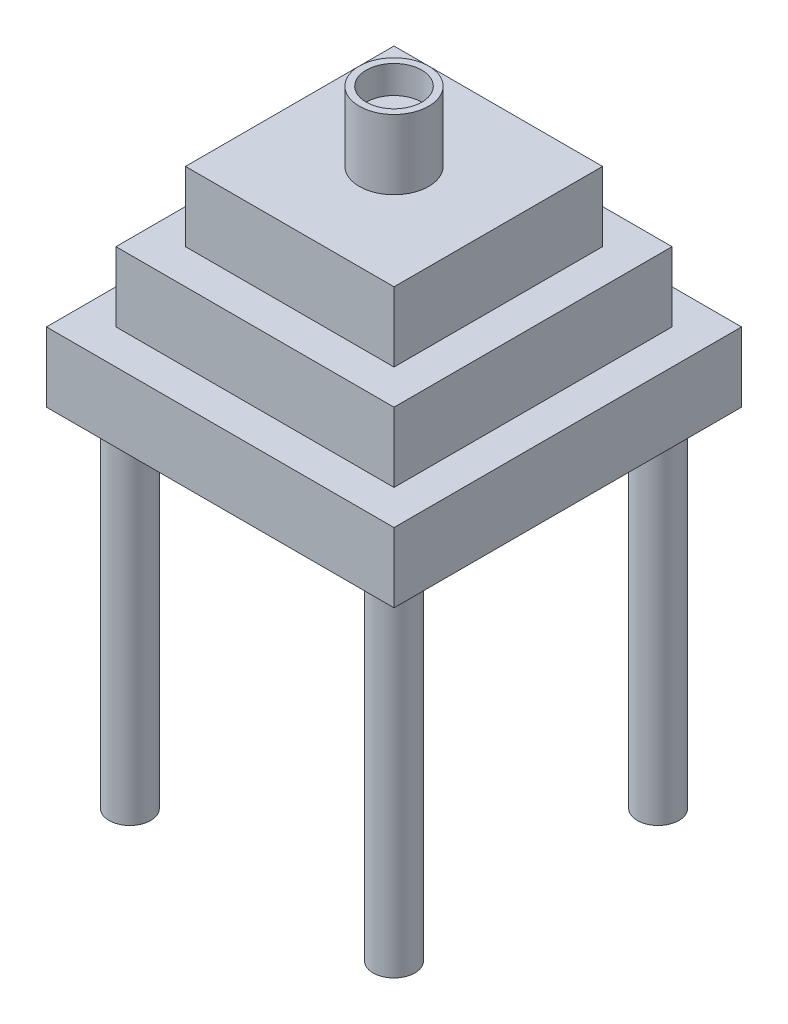
ISO-10303-21;
HEADER;
FILE_DESCRIPTION(('STEP AP214'),'2;1');
FILE_NAME('part.step','',(''),(''),'','','');
FILE_SCHEMA(('AUTOMOTIVE_DESIGN { 1 0 10303 214 1 1 1 1 }'));
ENDSEC;
DATA;
#1=APPLICATION_CONTEXT('core data for automotive mechanical design processes');
#2=APPLICATION_PROTOCOL_DEFINITION('international standard','automotive_design',2000,#1);
#3=PRODUCT_CONTEXT('',#1,'mechanical');
#4=PRODUCT('Part','Part','',(#3));
#5=PRODUCT_RELATED_PRODUCT_CATEGORY('part','',(#4));
#6=PRODUCT_DEFINITION_FORMATION('','',#4);
#7=PRODUCT_DEFINITION_CONTEXT('part definition',#1,'design');
#8=PRODUCT_DEFINITION('design','',#6,#7);
#9=PRODUCT_DEFINITION_SHAPE('','',#8);
#10=(LENGTH_UNIT() NAMED_UNIT(*) SI_UNIT(.MILLI.,.METRE.));
#11=(NAMED_UNIT(*) PLANE_ANGLE_UNIT() SI_UNIT($,.RADIAN.));
#12=(NAMED_UNIT(*) SI_UNIT($,.STERADIAN.) SOLID_ANGLE_UNIT());
#13=UNCERTAINTY_MEASURE_WITH_UNIT(LENGTH_MEASURE(1.E-05),#10,'distance_accuracy_value','');
#14=(GEOMETRIC_REPRESENTATION_CONTEXT(3) GLOBAL_UNCERTAINTY_ASSIGNED_CONTEXT((#13)) GLOBAL_UNIT_ASSIGNED_CONTEXT((#10,
#11,#12)) REPRESENTATION_CONTEXT('',''));
#15=CARTESIAN_POINT('',(0.,0.,0.));
#16=DIRECTION('',(0.,0.,1.));
#17=DIRECTION('',(1.,0.,0.));
#18=AXIS2_PLACEMENT_3D('',#15,#16,#17);
#19=CARTESIAN_POINT('',(0.,700.,0.));
#20=DIRECTION('',(0.,-1.,0.));
#21=DIRECTION('',(0.,0.,-1.));
#22=AXIS2_PLACEMENT_3D('',#19,#20,#21);
#23=PLANE('',#22);
#24=DIRECTION('',(0.,0.,-1.));
#25=VECTOR('',#24,1.);
#26=CARTESIAN_POINT('',(200.,700.,200.));
#27=LINE('',#26,#25);
#28=CARTESIAN_POINT('',(200.,700.,200.));
#29=VERTEX_POINT('',#28);
#30=CARTESIAN_POINT('',(200.,700.,-200.));
#31=VERTEX_POINT('',#30);
#32=EDGE_CURVE('E159',#29,#31,#27,.T.);
#33=ORIENTED_EDGE('',*,*,#32,.T.);
#34=DIRECTION('',(-1.,0.,0.));
#35=VECTOR('',#34,1.);
#36=CARTESIAN_POINT('',(-200.,700.,-200.));
#37=LINE('',#36,#35);
#38=CARTESIAN_POINT('',(-200.,700.,-200.));
#39=VERTEX_POINT('',#38);
#40=EDGE_CURVE('E162',#31,#39,#37,.T.);
#41=ORIENTED_EDGE('',*,*,#40,.T.);
#42=DIRECTION('',(0.,0.,1.));
#43=VECTOR('',#42,1.);
#44=CARTESIAN_POINT('',(-200.,700.,200.));
#45=LINE('',#44,#43);
#46=CARTESIAN_POINT('',(-200.,700.,200.));
#47=VERTEX_POINT('',#46);
#48=EDGE_CURVE('E165',#39,#47,#45,.T.);
#49=ORIENTED_EDGE('',*,*,#48,.T.);
#50=DIRECTION('',(1.,0.,0.));
#51=VECTOR('',#50,1.);
#52=CARTESIAN_POINT('',(-200.,700.,200.));
#53=LINE('',#52,#51);
#54=EDGE_CURVE('E167',#47,#29,#53,.T.);
#55=ORIENTED_EDGE('',*,*,#54,.T.);
#56=EDGE_LOOP('',(#33,#41,#49,#55));
#57=FACE_BOUND('',#56,.T.);
#58=DIRECTION('',(0.,0.,-1.));
#59=VECTOR('',#58,1.);
#60=CARTESIAN_POINT('',(150.,700.,150.));
#61=LINE('',#60,#59);
#62=CARTESIAN_POINT('',(150.,700.,150.));
#63=VERTEX_POINT('',#62);
#64=CARTESIAN_POINT('',(150.,700.,-150.));
#65=VERTEX_POINT('',#64);
#66=EDGE_CURVE('E56',#63,#65,#61,.T.);
#67=ORIENTED_EDGE('',*,*,#66,.F.);
#68=DIRECTION('',(1.,0.,0.));
#69=VECTOR('',#68,1.);
#70=CARTESIAN_POINT('',(-150.,700.,150.));
#71=LINE('',#70,#69);
#72=CARTESIAN_POINT('',(-150.,700.,150.));
#73=VERTEX_POINT('',#72);
#74=EDGE_CURVE('E60',#73,#63,#71,.T.);
#75=ORIENTED_EDGE('',*,*,#74,.F.);
#76=DIRECTION('',(0.,0.,1.));
#77=VECTOR('',#76,1.);
#78=CARTESIAN_POINT('',(-150.,700.,150.));
#79=LINE('',#78,#77);
#80=CARTESIAN_POINT('',(-150.,700.,-150.));
#81=VERTEX_POINT('',#80);
#82=EDGE_CURVE('E604',#81,#73,#79,.T.);
#83=ORIENTED_EDGE('',*,*,#82,.F.);
#84=DIRECTION('',(-1.,0.,0.));
#85=VECTOR('',#84,1.);
#86=CARTESIAN_POINT('',(-150.,700.,-150.));
#87=LINE('',#86,#85);
#88=EDGE_CURVE('E602',#65,#81,#87,.T.);
#89=ORIENTED_EDGE('',*,*,#88,.F.);
#90=EDGE_LOOP('',(#67,#75,#83,#89));
#91=FACE_BOUND('',#90,.T.);
#92=ADVANCED_FACE('F39',(#57,#91),#23,.F.);
#93=CARTESIAN_POINT('',(0.,600.,0.));
#94=DIRECTION('',(0.,-1.,0.));
#95=DIRECTION('',(0.,0.,-1.));
#96=AXIS2_PLACEMENT_3D('',#93,#94,#95);
#97=PLANE('',#96);
#98=DIRECTION('',(0.,0.,-1.));
#99=VECTOR('',#98,1.);
#100=CARTESIAN_POINT('',(250.,600.,250.));
#101=LINE('',#100,#99);
#102=CARTESIAN_POINT('',(250.,600.,250.));
#103=VERTEX_POINT('',#102);
#104=CARTESIAN_POINT('',(250.,600.,-250.));
#105=VERTEX_POINT('',#104);
#106=EDGE_CURVE('E207',#103,#105,#101,.T.);
#107=ORIENTED_EDGE('',*,*,#106,.T.);
#108=DIRECTION('',(-1.,0.,0.));
#109=VECTOR('',#108,1.);
#110=CARTESIAN_POINT('',(-250.,600.,-250.));
#111=LINE('',#110,#109);
#112=CARTESIAN_POINT('',(-250.,600.,-250.));
#113=VERTEX_POINT('',#112);
#114=EDGE_CURVE('E210',#105,#113,#111,.T.);
#115=ORIENTED_EDGE('',*,*,#114,.T.);
#116=DIRECTION('',(0.,0.,1.));
#117=VECTOR('',#116,1.);
#118=CARTESIAN_POINT('',(-250.,600.,250.));
#119=LINE('',#118,#117);
#120=CARTESIAN_POINT('',(-250.,600.,250.));
#121=VERTEX_POINT('',#120);
#122=EDGE_CURVE('E213',#113,#121,#119,.T.);
#123=ORIENTED_EDGE('',*,*,#122,.T.);
#124=DIRECTION('',(1.,0.,0.));
#125=VECTOR('',#124,1.);
#126=CARTESIAN_POINT('',(-250.,600.,250.));
#127=LINE('',#126,#125);
#128=EDGE_CURVE('E215',#121,#103,#127,.T.);
#129=ORIENTED_EDGE('',*,*,#128,.T.);
#130=EDGE_LOOP('',(#107,#115,#123,#129));
#131=FACE_BOUND('',#130,.T.);
#132=DIRECTION('',(0.,0.,-1.));
#133=VECTOR('',#132,1.);
#134=CARTESIAN_POINT('',(200.,600.,200.));
#135=LINE('',#134,#133);
#136=CARTESIAN_POINT('',(200.,600.,200.));
#137=VERTEX_POINT('',#136);
#138=CARTESIAN_POINT('',(200.,600.,-200.));
#139=VERTEX_POINT('',#138);
#140=EDGE_CURVE('E150',#137,#139,#135,.T.);
#141=ORIENTED_EDGE('',*,*,#140,.F.);
#142=DIRECTION('',(1.,0.,0.));
#143=VECTOR('',#142,1.);
#144=CARTESIAN_POINT('',(-200.,600.,200.));
#145=LINE('',#144,#143);
#146=CARTESIAN_POINT('',(-200.,600.,200.));
#147=VERTEX_POINT('',#146);
#148=EDGE_CURVE('E163',#147,#137,#145,.T.);
#149=ORIENTED_EDGE('',*,*,#148,.F.);
#150=DIRECTION('',(0.,0.,1.));
#151=VECTOR('',#150,1.);
#152=CARTESIAN_POINT('',(-200.,600.,200.));
#153=LINE('',#152,#151);
#154=CARTESIAN_POINT('',(-200.,600.,-200.));
#155=VERTEX_POINT('',#154);
#156=EDGE_CURVE('E172',#155,#147,#153,.T.);
#157=ORIENTED_EDGE('',*,*,#156,.F.);
#158=DIRECTION('',(-1.,0.,0.));
#159=VECTOR('',#158,1.);
#160=CARTESIAN_POINT('',(-200.,600.,-200.));
#161=LINE('',#160,#159);
#162=EDGE_CURVE('E153',#139,#155,#161,.T.);
#163=ORIENTED_EDGE('',*,*,#162,.F.);
#164=EDGE_LOOP('',(#141,#149,#157,#163));
#165=FACE_BOUND('',#164,.T.);
#166=ADVANCED_FACE('F252',(#131,#165),#97,.F.);
#167=CARTESIAN_POINT('',(-190.,500.,190.));
#168=DIRECTION('',(0.,-1.,0.));
#169=DIRECTION('',(0.,0.,-1.));
#170=AXIS2_PLACEMENT_3D('',#167,#168,#169);
#171=CYLINDRICAL_SURFACE('',#170,30.);
#172=CARTESIAN_POINT('',(-190.,500.,190.));
#173=DIRECTION('',(0.,1.,0.));
#174=DIRECTION('',(0.,0.,1.));
#175=AXIS2_PLACEMENT_3D('',#172,#173,#174);
#176=CIRCLE('',#175,30.);
#177=CARTESIAN_POINT('',(-190.,500.,220.));
#178=VERTEX_POINT('',#177);
#179=EDGE_CURVE('E48',#178,#178,#176,.T.);
#180=ORIENTED_EDGE('',*,*,#179,.F.);
#181=EDGE_LOOP('',(#180));
#182=FACE_BOUND('',#181,.T.);
#183=CARTESIAN_POINT('',(-190.,0.,190.));
#184=DIRECTION('',(0.,1.,0.));
#185=DIRECTION('',(0.,0.,1.));
#186=AXIS2_PLACEMENT_3D('',#183,#184,#185);
#187=CIRCLE('',#186,30.);
#188=CARTESIAN_POINT('',(-190.,0.,220.));
#189=VERTEX_POINT('',#188);
#190=EDGE_CURVE('E43',#189,#189,#187,.T.);
#191=ORIENTED_EDGE('',*,*,#190,.T.);
#192=EDGE_LOOP('',(#191));
#193=FACE_BOUND('',#192,.T.);
#194=ADVANCED_FACE('F41',(#182,#193),#171,.T.);
#195=CARTESIAN_POINT('',(-190.,0.,190.));
#196=DIRECTION('',(0.,1.,0.));
#197=DIRECTION('',(0.,0.,1.));
#198=AXIS2_PLACEMENT_3D('',#195,#196,#197);
#199=PLANE('',#198);
#200=ORIENTED_EDGE('',*,*,#190,.F.);
#201=EDGE_LOOP('',(#200));
#202=FACE_BOUND('',#201,.T.);
#203=ADVANCED_FACE('F242',(#202),#199,.F.);
#204=CARTESIAN_POINT('',(250.,600.,250.));
#205=DIRECTION('',(-1.,0.,0.));
#206=DIRECTION('',(0.,0.,1.));
#207=AXIS2_PLACEMENT_3D('',#204,#205,#206);
#208=PLANE('',#207);
#209=DIRECTION('',(0.,0.,-1.));
#210=VECTOR('',#209,1.);
#211=CARTESIAN_POINT('',(250.,500.,250.));
#212=LINE('',#211,#210);
#213=CARTESIAN_POINT('',(250.,500.,250.));
#214=VERTEX_POINT('',#213);
#215=CARTESIAN_POINT('',(250.,500.,-250.));
#216=VERTEX_POINT('',#215);
#217=EDGE_CURVE('E204',#214,#216,#212,.T.);
#218=ORIENTED_EDGE('',*,*,#217,.T.);
#219=DIRECTION('',(0.,-1.,0.));
#220=VECTOR('',#219,1.);
#221=CARTESIAN_POINT('',(250.,600.,-250.));
#222=LINE('',#221,#220);
#223=EDGE_CURVE('E233',#105,#216,#222,.T.);
#224=ORIENTED_EDGE('',*,*,#223,.F.);
#225=ORIENTED_EDGE('',*,*,#106,.F.);
#226=DIRECTION('',(0.,-1.,0.));
#227=VECTOR('',#226,1.);
#228=CARTESIAN_POINT('',(250.,600.,250.));
#229=LINE('',#228,#227);
#230=EDGE_CURVE('E217',#103,#214,#229,.T.);
#231=ORIENTED_EDGE('',*,*,#230,.T.);
#232=EDGE_LOOP('',(#218,#224,#225,#231));
#233=FACE_BOUND('',#232,.T.);
#234=ADVANCED_FACE('F244',(#233),#208,.F.);
#235=CARTESIAN_POINT('',(-250.,600.,-250.));
#236=DIRECTION('',(0.,0.,1.));
#237=DIRECTION('',(1.,0.,0.));
#238=AXIS2_PLACEMENT_3D('',#235,#236,#237);
#239=PLANE('',#238);
#240=DIRECTION('',(-1.,0.,0.));
#241=VECTOR('',#240,1.);
#242=CARTESIAN_POINT('',(-250.,500.,-250.));
#243=LINE('',#242,#241);
#244=CARTESIAN_POINT('',(-250.,500.,-250.));
#245=VERTEX_POINT('',#244);
#246=EDGE_CURVE('E220',#216,#245,#243,.T.);
#247=ORIENTED_EDGE('',*,*,#246,.T.);
#248=DIRECTION('',(0.,-1.,0.));
#249=VECTOR('',#248,1.);
#250=CARTESIAN_POINT('',(-250.,600.,-250.));
#251=LINE('',#250,#249);
#252=EDGE_CURVE('E230',#113,#245,#251,.T.);
#253=ORIENTED_EDGE('',*,*,#252,.F.);
#254=ORIENTED_EDGE('',*,*,#114,.F.);
#255=ORIENTED_EDGE('',*,*,#223,.T.);
#256=EDGE_LOOP('',(#247,#253,#254,#255));
#257=FACE_BOUND('',#256,.T.);
#258=ADVANCED_FACE('F249',(#257),#239,.F.);
#259=CARTESIAN_POINT('',(-250.,600.,250.));
#260=DIRECTION('',(1.,0.,0.));
#261=DIRECTION('',(0.,0.,-1.));
#262=AXIS2_PLACEMENT_3D('',#259,#260,#261);
#263=PLANE('',#262);
#264=DIRECTION('',(0.,0.,1.));
#265=VECTOR('',#264,1.);
#266=CARTESIAN_POINT('',(-250.,500.,250.));
#267=LINE('',#266,#265);
#268=CARTESIAN_POINT('',(-250.,500.,250.));
#269=VERTEX_POINT('',#268);
#270=EDGE_CURVE('E222',#245,#269,#267,.T.);
#271=ORIENTED_EDGE('',*,*,#270,.T.);
#272=DIRECTION('',(0.,-1.,0.));
#273=VECTOR('',#272,1.);
#274=CARTESIAN_POINT('',(-250.,600.,250.));
#275=LINE('',#274,#273);
#276=EDGE_CURVE('E227',#121,#269,#275,.T.);
#277=ORIENTED_EDGE('',*,*,#276,.F.);
#278=ORIENTED_EDGE('',*,*,#122,.F.);
#279=ORIENTED_EDGE('',*,*,#252,.T.);
#280=EDGE_LOOP('',(#271,#277,#278,#279));
#281=FACE_BOUND('',#280,.T.);
#282=ADVANCED_FACE('F312',(#281),#263,.F.);
#283=CARTESIAN_POINT('',(-250.,600.,250.));
#284=DIRECTION('',(0.,0.,-1.));
#285=DIRECTION('',(-1.,0.,0.));
#286=AXIS2_PLACEMENT_3D('',#283,#284,#285);
#287=PLANE('',#286);
#288=DIRECTION('',(1.,0.,0.));
#289=VECTOR('',#288,1.);
#290=CARTESIAN_POINT('',(-250.,500.,250.));
#291=LINE('',#290,#289);
#292=EDGE_CURVE('E211',#269,#214,#291,.T.);
#293=ORIENTED_EDGE('',*,*,#292,.T.);
#294=ORIENTED_EDGE('',*,*,#230,.F.);
#295=ORIENTED_EDGE('',*,*,#128,.F.);
#296=ORIENTED_EDGE('',*,*,#276,.T.);
#297=EDGE_LOOP('',(#293,#294,#295,#296));
#298=FACE_BOUND('',#297,.T.);
#299=ADVANCED_FACE('F308',(#298),#287,.F.);
#300=CARTESIAN_POINT('',(0.,500.,0.));
#301=DIRECTION('',(0.,-1.,0.));
#302=DIRECTION('',(0.,0.,-1.));
#303=AXIS2_PLACEMENT_3D('',#300,#301,#302);
#304=PLANE('',#303);
#305=CARTESIAN_POINT('',(190.,500.,190.));
#306=DIRECTION('',(0.,1.,0.));
#307=DIRECTION('',(0.,0.,1.));
#308=AXIS2_PLACEMENT_3D('',#305,#306,#307);
#309=CIRCLE('',#308,30.);
#310=CARTESIAN_POINT('',(190.,500.,220.));
#311=VERTEX_POINT('',#310);
#312=EDGE_CURVE('E188',#311,#311,#309,.T.);
#313=ORIENTED_EDGE('',*,*,#312,.T.);
#314=EDGE_LOOP('',(#313));
#315=FACE_BOUND('',#314,.T.);
#316=CARTESIAN_POINT('',(190.,500.,-190.));
#317=DIRECTION('',(0.,1.,0.));
#318=DIRECTION('',(0.,0.,1.));
#319=AXIS2_PLACEMENT_3D('',#316,#317,#318);
#320=CIRCLE('',#319,30.);
#321=CARTESIAN_POINT('',(190.,500.,-160.));
#322=VERTEX_POINT('',#321);
#323=EDGE_CURVE('E192',#322,#322,#320,.T.);
#324=ORIENTED_EDGE('',*,*,#323,.T.);
#325=EDGE_LOOP('',(#324));
#326=FACE_BOUND('',#325,.T.);
#327=CARTESIAN_POINT('',(-190.,500.,-190.));
#328=DIRECTION('',(0.,1.,0.));
#329=DIRECTION('',(0.,0.,1.));
#330=AXIS2_PLACEMENT_3D('',#327,#328,#329);
#331=CIRCLE('',#330,30.);
#332=CARTESIAN_POINT('',(-190.,500.,-160.));
#333=VERTEX_POINT('',#332);
#334=EDGE_CURVE('E198',#333,#333,#331,.T.);
#335=ORIENTED_EDGE('',*,*,#334,.T.);
#336=EDGE_LOOP('',(#335));
#337=FACE_BOUND('',#336,.T.);
#338=ORIENTED_EDGE('',*,*,#179,.T.);
#339=EDGE_LOOP('',(#338));
#340=FACE_BOUND('',#339,.T.);
#341=ORIENTED_EDGE('',*,*,#217,.F.);
#342=ORIENTED_EDGE('',*,*,#292,.F.);
#343=ORIENTED_EDGE('',*,*,#270,.F.);
#344=ORIENTED_EDGE('',*,*,#246,.F.);
#345=EDGE_LOOP('',(#341,#342,#343,#344));
#346=FACE_BOUND('',#345,.T.);
#347=ADVANCED_FACE('F301',(#315,#326,#337,#340,#346),#304,.T.);
#348=CARTESIAN_POINT('',(-190.,500.,-190.));
#349=DIRECTION('',(0.,-1.,0.));
#350=DIRECTION('',(0.,0.,-1.));
#351=AXIS2_PLACEMENT_3D('',#348,#349,#350);
#352=CYLINDRICAL_SURFACE('',#351,30.);
#353=ORIENTED_EDGE('',*,*,#334,.F.);
#354=EDGE_LOOP('',(#353));
#355=FACE_BOUND('',#354,.T.);
#356=CARTESIAN_POINT('',(-190.,0.,-190.));
#357=DIRECTION('',(0.,1.,0.));
#358=DIRECTION('',(0.,0.,1.));
#359=AXIS2_PLACEMENT_3D('',#356,#357,#358);
#360=CIRCLE('',#359,30.);
#361=CARTESIAN_POINT('',(-190.,0.,-160.));
#362=VERTEX_POINT('',#361);
#363=EDGE_CURVE('E201',#362,#362,#360,.T.);
#364=ORIENTED_EDGE('',*,*,#363,.T.);
#365=EDGE_LOOP('',(#364));
#366=FACE_BOUND('',#365,.T.);
#367=ADVANCED_FACE('F298',(#355,#366),#352,.T.);
#368=CARTESIAN_POINT('',(-190.,0.,-190.));
#369=DIRECTION('',(0.,1.,0.));
#370=DIRECTION('',(0.,0.,1.));
#371=AXIS2_PLACEMENT_3D('',#368,#369,#370);
#372=PLANE('',#371);
#373=ORIENTED_EDGE('',*,*,#363,.F.);
#374=EDGE_LOOP('',(#373));
#375=FACE_BOUND('',#374,.T.);
#376=ADVANCED_FACE('F293',(#375),#372,.F.);
#377=CARTESIAN_POINT('',(190.,500.,-190.));
#378=DIRECTION('',(0.,-1.,0.));
#379=DIRECTION('',(0.,0.,-1.));
#380=AXIS2_PLACEMENT_3D('',#377,#378,#379);
#381=CYLINDRICAL_SURFACE('',#380,30.);
#382=ORIENTED_EDGE('',*,*,#323,.F.);
#383=EDGE_LOOP('',(#382));
#384=FACE_BOUND('',#383,.T.);
#385=CARTESIAN_POINT('',(190.,0.,-190.));
#386=DIRECTION('',(0.,1.,0.));
#387=DIRECTION('',(0.,0.,1.));
#388=AXIS2_PLACEMENT_3D('',#385,#386,#387);
#389=CIRCLE('',#388,30.);
#390=CARTESIAN_POINT('',(190.,0.,-160.));
#391=VERTEX_POINT('',#390);
#392=EDGE_CURVE('E195',#391,#391,#389,.T.);
#393=ORIENTED_EDGE('',*,*,#392,.T.);
#394=EDGE_LOOP('',(#393));
#395=FACE_BOUND('',#394,.T.);
#396=ADVANCED_FACE('F290',(#384,#395),#381,.T.);
#397=CARTESIAN_POINT('',(190.,0.,-190.));
#398=DIRECTION('',(0.,1.,0.));
#399=DIRECTION('',(0.,0.,1.));
#400=AXIS2_PLACEMENT_3D('',#397,#398,#399);
#401=PLANE('',#400);
#402=ORIENTED_EDGE('',*,*,#392,.F.);
#403=EDGE_LOOP('',(#402));
#404=FACE_BOUND('',#403,.T.);
#405=ADVANCED_FACE('F285',(#404),#401,.F.);
#406=CARTESIAN_POINT('',(190.,500.,190.));
#407=DIRECTION('',(0.,-1.,0.));
#408=DIRECTION('',(0.,0.,-1.));
#409=AXIS2_PLACEMENT_3D('',#406,#407,#408);
#410=CYLINDRICAL_SURFACE('',#409,30.);
#411=ORIENTED_EDGE('',*,*,#312,.F.);
#412=EDGE_LOOP('',(#411));
#413=FACE_BOUND('',#412,.T.);
#414=CARTESIAN_POINT('',(190.,0.,190.));
#415=DIRECTION('',(0.,1.,0.));
#416=DIRECTION('',(0.,0.,1.));
#417=AXIS2_PLACEMENT_3D('',#414,#415,#416);
#418=CIRCLE('',#417,30.);
#419=CARTESIAN_POINT('',(190.,0.,220.));
#420=VERTEX_POINT('',#419);
#421=EDGE_CURVE('E189',#420,#420,#418,.T.);
#422=ORIENTED_EDGE('',*,*,#421,.T.);
#423=EDGE_LOOP('',(#422));
#424=FACE_BOUND('',#423,.T.);
#425=ADVANCED_FACE('F282',(#413,#424),#410,.T.);
#426=CARTESIAN_POINT('',(190.,0.,190.));
#427=DIRECTION('',(0.,1.,0.));
#428=DIRECTION('',(0.,0.,1.));
#429=AXIS2_PLACEMENT_3D('',#426,#427,#428);
#430=PLANE('',#429);
#431=ORIENTED_EDGE('',*,*,#421,.F.);
#432=EDGE_LOOP('',(#431));
#433=FACE_BOUND('',#432,.T.);
#434=ADVANCED_FACE('F280',(#433),#430,.F.);
#435=CARTESIAN_POINT('',(200.,700.,200.));
#436=DIRECTION('',(-1.,0.,0.));
#437=DIRECTION('',(0.,0.,1.));
#438=AXIS2_PLACEMENT_3D('',#435,#436,#437);
#439=PLANE('',#438);
#440=ORIENTED_EDGE('',*,*,#140,.T.);
#441=DIRECTION('',(0.,-1.,0.));
#442=VECTOR('',#441,1.);
#443=CARTESIAN_POINT('',(200.,700.,-200.));
#444=LINE('',#443,#442);
#445=EDGE_CURVE('E185',#31,#139,#444,.T.);
#446=ORIENTED_EDGE('',*,*,#445,.F.);
#447=ORIENTED_EDGE('',*,*,#32,.F.);
#448=DIRECTION('',(0.,-1.,0.));
#449=VECTOR('',#448,1.);
#450=CARTESIAN_POINT('',(200.,700.,200.));
#451=LINE('',#450,#449);
#452=EDGE_CURVE('E168',#29,#137,#451,.T.);
#453=ORIENTED_EDGE('',*,*,#452,.T.);
#454=EDGE_LOOP('',(#440,#446,#447,#453));
#455=FACE_BOUND('',#454,.T.);
#456=ADVANCED_FACE('F276',(#455),#439,.F.);
#457=CARTESIAN_POINT('',(-200.,700.,-200.));
#458=DIRECTION('',(0.,0.,1.));
#459=DIRECTION('',(1.,0.,0.));
#460=AXIS2_PLACEMENT_3D('',#457,#458,#459);
#461=PLANE('',#460);
#462=ORIENTED_EDGE('',*,*,#162,.T.);
#463=DIRECTION('',(0.,-1.,0.));
#464=VECTOR('',#463,1.);
#465=CARTESIAN_POINT('',(-200.,700.,-200.));
#466=LINE('',#465,#464);
#467=EDGE_CURVE('E182',#39,#155,#466,.T.);
#468=ORIENTED_EDGE('',*,*,#467,.F.);
#469=ORIENTED_EDGE('',*,*,#40,.F.);
#470=ORIENTED_EDGE('',*,*,#445,.T.);
#471=EDGE_LOOP('',(#462,#468,#469,#470));
#472=FACE_BOUND('',#471,.T.);
#473=ADVANCED_FACE('F272',(#472),#461,.F.);
#474=CARTESIAN_POINT('',(-200.,700.,200.));
#475=DIRECTION('',(1.,0.,0.));
#476=DIRECTION('',(0.,0.,-1.));
#477=AXIS2_PLACEMENT_3D('',#474,#475,#476);
#478=PLANE('',#477);
#479=ORIENTED_EDGE('',*,*,#156,.T.);
#480=DIRECTION('',(0.,-1.,0.));
#481=VECTOR('',#480,1.);
#482=CARTESIAN_POINT('',(-200.,700.,200.));
#483=LINE('',#482,#481);
#484=EDGE_CURVE('E179',#47,#147,#483,.T.);
#485=ORIENTED_EDGE('',*,*,#484,.F.);
#486=ORIENTED_EDGE('',*,*,#48,.F.);
#487=ORIENTED_EDGE('',*,*,#467,.T.);
#488=EDGE_LOOP('',(#479,#485,#486,#487));
#489=FACE_BOUND('',#488,.T.);
#490=ADVANCED_FACE('F268',(#489),#478,.F.);
#491=CARTESIAN_POINT('',(-200.,700.,200.));
#492=DIRECTION('',(0.,0.,-1.));
#493=DIRECTION('',(-1.,0.,0.));
#494=AXIS2_PLACEMENT_3D('',#491,#492,#493);
#495=PLANE('',#494);
#496=ORIENTED_EDGE('',*,*,#148,.T.);
#497=ORIENTED_EDGE('',*,*,#452,.F.);
#498=ORIENTED_EDGE('',*,*,#54,.F.);
#499=ORIENTED_EDGE('',*,*,#484,.T.);
#500=EDGE_LOOP('',(#496,#497,#498,#499));
#501=FACE_BOUND('',#500,.T.);
#502=ADVANCED_FACE('F265',(#501),#495,.F.);
#503=CARTESIAN_POINT('',(150.,800.,150.));
#504=DIRECTION('',(-1.,0.,0.));
#505=DIRECTION('',(0.,0.,1.));
#506=AXIS2_PLACEMENT_3D('',#503,#504,#505);
#507=PLANE('',#506);
#508=ORIENTED_EDGE('',*,*,#66,.T.);
#509=DIRECTION('',(0.,-1.,0.));
#510=VECTOR('',#509,1.);
#511=CARTESIAN_POINT('',(150.,800.,-150.));
#512=LINE('',#511,#510);
#513=CARTESIAN_POINT('',(150.,800.,-150.));
#514=VERTEX_POINT('',#513);
#515=EDGE_CURVE('E133',#514,#65,#512,.T.);
#516=ORIENTED_EDGE('',*,*,#515,.F.);
#517=DIRECTION('',(0.,0.,-1.));
#518=VECTOR('',#517,1.);
#519=CARTESIAN_POINT('',(150.,800.,150.));
#520=LINE('',#519,#518);
#521=CARTESIAN_POINT('',(150.,800.,150.));
#522=VERTEX_POINT('',#521);
#523=EDGE_CURVE('E139',#522,#514,#520,.T.);
#524=ORIENTED_EDGE('',*,*,#523,.F.);
#525=DIRECTION('',(0.,-1.,0.));
#526=VECTOR('',#525,1.);
#527=CARTESIAN_POINT('',(150.,800.,150.));
#528=LINE('',#527,#526);
#529=EDGE_CURVE('E600',#522,#63,#528,.T.);
#530=ORIENTED_EDGE('',*,*,#529,.T.);
#531=EDGE_LOOP('',(#508,#516,#524,#530));
#532=FACE_BOUND('',#531,.T.);
#533=ADVANCED_FACE('F149',(#532),#507,.F.);
#534=CARTESIAN_POINT('',(-150.,800.,-150.));
#535=DIRECTION('',(0.,0.,1.));
#536=DIRECTION('',(1.,0.,0.));
#537=AXIS2_PLACEMENT_3D('',#534,#535,#536);
#538=PLANE('',#537);
#539=ORIENTED_EDGE('',*,*,#88,.T.);
#540=DIRECTION('',(0.,-1.,0.));
#541=VECTOR('',#540,1.);
#542=CARTESIAN_POINT('',(-150.,800.,-150.));
#543=LINE('',#542,#541);
#544=CARTESIAN_POINT('',(-150.,800.,-150.));
#545=VERTEX_POINT('',#544);
#546=EDGE_CURVE('E135',#545,#81,#543,.T.);
#547=ORIENTED_EDGE('',*,*,#546,.F.);
#548=DIRECTION('',(-1.,0.,0.));
#549=VECTOR('',#548,1.);
#550=CARTESIAN_POINT('',(-150.,800.,-150.));
#551=LINE('',#550,#549);
#552=EDGE_CURVE('E128',#514,#545,#551,.T.);
#553=ORIENTED_EDGE('',*,*,#552,.F.);
#554=ORIENTED_EDGE('',*,*,#515,.T.);
#555=EDGE_LOOP('',(#539,#547,#553,#554));
#556=FACE_BOUND('',#555,.T.);
#557=ADVANCED_FACE('F131',(#556),#538,.F.);
#558=CARTESIAN_POINT('',(-150.,800.,150.));
#559=DIRECTION('',(1.,0.,0.));
#560=DIRECTION('',(0.,0.,-1.));
#561=AXIS2_PLACEMENT_3D('',#558,#559,#560);
#562=PLANE('',#561);
#563=ORIENTED_EDGE('',*,*,#82,.T.);
#564=DIRECTION('',(0.,-1.,0.));
#565=VECTOR('',#564,1.);
#566=CARTESIAN_POINT('',(-150.,800.,150.));
#567=LINE('',#566,#565);
#568=CARTESIAN_POINT('',(-150.,800.,150.));
#569=VERTEX_POINT('',#568);
#570=EDGE_CURVE('E155',#569,#73,#567,.T.);
#571=ORIENTED_EDGE('',*,*,#570,.F.);
#572=DIRECTION('',(0.,0.,1.));
#573=VECTOR('',#572,1.);
#574=CARTESIAN_POINT('',(-150.,800.,150.));
#575=LINE('',#574,#573);
#576=EDGE_CURVE('E138',#545,#569,#575,.T.);
#577=ORIENTED_EDGE('',*,*,#576,.F.);
#578=ORIENTED_EDGE('',*,*,#546,.T.);
#579=EDGE_LOOP('',(#563,#571,#577,#578));
#580=FACE_BOUND('',#579,.T.);
#581=ADVANCED_FACE('F406',(#580),#562,.F.);
#582=CARTESIAN_POINT('',(-150.,800.,150.));
#583=DIRECTION('',(0.,0.,-1.));
#584=DIRECTION('',(-1.,0.,0.));
#585=AXIS2_PLACEMENT_3D('',#582,#583,#584);
#586=PLANE('',#585);
#587=ORIENTED_EDGE('',*,*,#74,.T.);
#588=ORIENTED_EDGE('',*,*,#529,.F.);
#589=DIRECTION('',(1.,0.,0.));
#590=VECTOR('',#589,1.);
#591=CARTESIAN_POINT('',(-150.,800.,150.));
#592=LINE('',#591,#590);
#593=EDGE_CURVE('E144',#569,#522,#592,.T.);
#594=ORIENTED_EDGE('',*,*,#593,.F.);
#595=ORIENTED_EDGE('',*,*,#570,.T.);
#596=EDGE_LOOP('',(#587,#588,#594,#595));
#597=FACE_BOUND('',#596,.T.);
#598=ADVANCED_FACE('F412',(#597),#586,.F.);
#599=CARTESIAN_POINT('',(0.,800.,0.));
#600=DIRECTION('',(0.,-1.,0.));
#601=DIRECTION('',(0.,0.,-1.));
#602=AXIS2_PLACEMENT_3D('',#599,#600,#601);
#603=PLANE('',#602);
#604=CARTESIAN_POINT('',(0.,800.,0.));
#605=DIRECTION('',(0.,1.,0.));
#606=DIRECTION('',(0.,0.,1.));
#607=AXIS2_PLACEMENT_3D('',#604,#605,#606);
#608=CIRCLE('',#607,50.);
#609=CARTESIAN_POINT('',(0.,800.,50.));
#610=VERTEX_POINT('',#609);
#611=EDGE_CURVE('E11',#610,#610,#608,.T.);
#612=ORIENTED_EDGE('',*,*,#611,.F.);
#613=EDGE_LOOP('',(#612));
#614=FACE_BOUND('',#613,.T.);
#615=ORIENTED_EDGE('',*,*,#523,.T.);
#616=ORIENTED_EDGE('',*,*,#552,.T.);
#617=ORIENTED_EDGE('',*,*,#576,.T.);
#618=ORIENTED_EDGE('',*,*,#593,.T.);
#619=EDGE_LOOP('',(#615,#616,#617,#618));
#620=FACE_BOUND('',#619,.T.);
#621=ADVANCED_FACE('F142',(#614,#620),#603,.F.);
#622=CARTESIAN_POINT('',(0.,900.,0.));
#623=DIRECTION('',(0.,-1.,0.));
#624=DIRECTION('',(0.,0.,-1.));
#625=AXIS2_PLACEMENT_3D('',#622,#623,#624);
#626=CYLINDRICAL_SURFACE('',#625,50.);
#627=CARTESIAN_POINT('',(0.,900.,0.));
#628=DIRECTION('',(0.,1.,0.));
#629=DIRECTION('',(0.,0.,1.));
#630=AXIS2_PLACEMENT_3D('',#627,#628,#629);
#631=CIRCLE('',#630,50.);
#632=CARTESIAN_POINT('',(0.,900.,50.));
#633=VERTEX_POINT('',#632);
#634=EDGE_CURVE('E590',#633,#633,#631,.T.);
#635=ORIENTED_EDGE('',*,*,#634,.F.);
#636=EDGE_LOOP('',(#635));
#637=FACE_BOUND('',#636,.T.);
#638=ORIENTED_EDGE('',*,*,#611,.T.);
#639=EDGE_LOOP('',(#638));
#640=FACE_BOUND('',#639,.T.);
#641=ADVANCED_FACE('F427',(#637,#640),#626,.T.);
#642=CARTESIAN_POINT('',(0.,900.,0.));
#643=DIRECTION('',(0.,1.,0.));
#644=DIRECTION('',(0.,0.,1.));
#645=AXIS2_PLACEMENT_3D('',#642,#643,#644);
#646=PLANE('',#645);
#647=CARTESIAN_POINT('',(0.,900.,0.));
#648=DIRECTION('',(0.,1.,0.));
#649=DIRECTION('',(0.,0.,1.));
#650=AXIS2_PLACEMENT_3D('',#647,#648,#649);
#651=CIRCLE('',#650,40.);
#652=CARTESIAN_POINT('',(0.,900.,40.));
#653=VERTEX_POINT('',#652);
#654=EDGE_CURVE('E591',#653,#653,#651,.T.);
#655=ORIENTED_EDGE('',*,*,#654,.F.);
#656=EDGE_LOOP('',(#655));
#657=FACE_BOUND('',#656,.T.);
#658=ORIENTED_EDGE('',*,*,#634,.T.);
#659=EDGE_LOOP('',(#658));
#660=FACE_BOUND('',#659,.T.);
#661=ADVANCED_FACE('F435',(#657,#660),#646,.T.);
#662=CARTESIAN_POINT('',(0.,860.,0.));
#663=DIRECTION('',(0.,1.,0.));
#664=DIRECTION('',(0.,0.,1.));
#665=AXIS2_PLACEMENT_3D('',#662,#663,#664);
#666=CYLINDRICAL_SURFACE('',#665,40.);
#667=CARTESIAN_POINT('',(0.,860.,0.));
#668=DIRECTION('',(0.,1.,0.));
#669=DIRECTION('',(0.,0.,1.));
#670=AXIS2_PLACEMENT_3D('',#667,#668,#669);
#671=CIRCLE('',#670,40.);
#672=CARTESIAN_POINT('',(0.,860.,40.));
#673=VERTEX_POINT('',#672);
#674=EDGE_CURVE('E589',#673,#673,#671,.T.);
#675=ORIENTED_EDGE('',*,*,#674,.F.);
#676=EDGE_LOOP('',(#675));
#677=FACE_BOUND('',#676,.T.);
#678=ORIENTED_EDGE('',*,*,#654,.T.);
#679=EDGE_LOOP('',(#678));
#680=FACE_BOUND('',#679,.T.);
#681=ADVANCED_FACE('F443',(#677,#680),#666,.F.);
#682=CARTESIAN_POINT('',(0.,860.,0.));
#683=DIRECTION('',(0.,1.,0.));
#684=DIRECTION('',(0.,0.,1.));
#685=AXIS2_PLACEMENT_3D('',#682,#683,#684);
#686=PLANE('',#685);
#687=ORIENTED_EDGE('',*,*,#674,.T.);
#688=EDGE_LOOP('',(#687));
#689=FACE_BOUND('',#688,.T.);
#690=ADVANCED_FACE('F451',(#689),#686,.T.);
#691=CLOSED_SHELL('',(#92,#166,#194,#203,#234,#258,#282,#299,#347,#367,#376,#396,#405,#425,#434,
#456,#473,#490,#502,#533,#557,#581,#598,#621,#641,#661,#681,#690));
#692=MANIFOLD_SOLID_BREP('B2',#691);
#693=ADVANCED_BREP_SHAPE_REPRESENTATION('',(#18,#692),#14);
#694=SHAPE_DEFINITION_REPRESENTATION(#9,#693);
ENDSEC;
END-ISO-10303-21;
